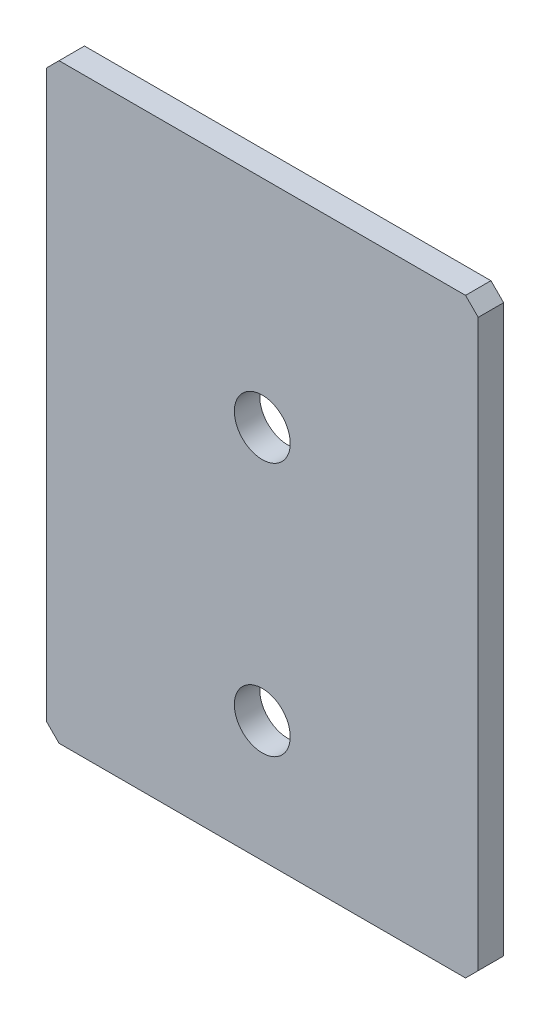
ISO-10303-21;
HEADER;
FILE_DESCRIPTION(('STEP AP214'),'2;1');
FILE_NAME('part.step','',(''),(''),'','','');
FILE_SCHEMA(('AUTOMOTIVE_DESIGN { 1 0 10303 214 1 1 1 1 }'));
ENDSEC;
DATA;
#1=APPLICATION_CONTEXT('core data for automotive mechanical design processes');
#2=APPLICATION_PROTOCOL_DEFINITION('international standard','automotive_design',2000,#1);
#3=PRODUCT_CONTEXT('',#1,'mechanical');
#4=PRODUCT('Part','Part','',(#3));
#5=PRODUCT_RELATED_PRODUCT_CATEGORY('part','',(#4));
#6=PRODUCT_DEFINITION_FORMATION('','',#4);
#7=PRODUCT_DEFINITION_CONTEXT('part definition',#1,'design');
#8=PRODUCT_DEFINITION('design','',#6,#7);
#9=PRODUCT_DEFINITION_SHAPE('','',#8);
#10=(LENGTH_UNIT() NAMED_UNIT(*) SI_UNIT(.MILLI.,.METRE.));
#11=(NAMED_UNIT(*) PLANE_ANGLE_UNIT() SI_UNIT($,.RADIAN.));
#12=(NAMED_UNIT(*) SI_UNIT($,.STERADIAN.) SOLID_ANGLE_UNIT());
#13=UNCERTAINTY_MEASURE_WITH_UNIT(LENGTH_MEASURE(1.E-05),#10,'distance_accuracy_value','');
#14=(GEOMETRIC_REPRESENTATION_CONTEXT(3) GLOBAL_UNCERTAINTY_ASSIGNED_CONTEXT((#13)) GLOBAL_UNIT_ASSIGNED_CONTEXT((#10,
#11,#12)) REPRESENTATION_CONTEXT('',''));
#15=CARTESIAN_POINT('',(0.,0.,0.));
#16=DIRECTION('',(0.,0.,1.));
#17=DIRECTION('',(1.,0.,0.));
#18=AXIS2_PLACEMENT_3D('',#15,#16,#17);
#19=CARTESIAN_POINT('',(0.,0.,10.));
#20=DIRECTION('',(0.,0.,1.));
#21=DIRECTION('',(1.,0.,0.));
#22=AXIS2_PLACEMENT_3D('',#19,#20,#21);
#23=PLANE('',#22);
#24=CARTESIAN_POINT('',(0.,0.,10.));
#25=DIRECTION('',(0.,0.,1.));
#26=DIRECTION('',(1.,0.,0.));
#27=AXIS2_PLACEMENT_3D('',#24,#25,#26);
#28=CIRCLE('',#27,11.);
#29=CARTESIAN_POINT('',(11.,0.,10.));
#30=VERTEX_POINT('',#29);
#31=EDGE_CURVE('E187',#30,#30,#28,.T.);
#32=ORIENTED_EDGE('',*,*,#31,.F.);
#33=EDGE_LOOP('',(#32));
#34=FACE_BOUND('',#33,.T.);
#35=DIRECTION('',(1.,0.,0.));
#36=VECTOR('',#35,1.);
#37=CARTESIAN_POINT('',(-85.,-147.717889212796,10.));
#38=LINE('',#37,#36);
#39=CARTESIAN_POINT('',(-80.,-147.717889212796,10.));
#40=VERTEX_POINT('',#39);
#41=CARTESIAN_POINT('',(80.,-147.717889212796,10.));
#42=VERTEX_POINT('',#41);
#43=EDGE_CURVE('E178',#40,#42,#38,.T.);
#44=ORIENTED_EDGE('',*,*,#43,.T.);
#45=DIRECTION('',(-0.707106781186551,-0.707106781186544,0.));
#46=VECTOR('',#45,1.);
#47=CARTESIAN_POINT('',(113.858944606398,-113.858944606399,10.));
#48=LINE('',#47,#46);
#49=CARTESIAN_POINT('',(85.,-142.717889212796,10.));
#50=VERTEX_POINT('',#49);
#51=EDGE_CURVE('E156',#42,#50,#48,.F.);
#52=ORIENTED_EDGE('',*,*,#51,.T.);
#53=DIRECTION('',(0.,1.,0.));
#54=VECTOR('',#53,1.);
#55=CARTESIAN_POINT('',(85.,85.,10.));
#56=LINE('',#55,#54);
#57=CARTESIAN_POINT('',(85.,80.,10.));
#58=VERTEX_POINT('',#57);
#59=EDGE_CURVE('E126',#50,#58,#56,.T.);
#60=ORIENTED_EDGE('',*,*,#59,.T.);
#61=DIRECTION('',(0.707106781186546,-0.707106781186549,0.));
#62=VECTOR('',#61,1.);
#63=CARTESIAN_POINT('',(82.5000000000003,82.4999999999998,10.));
#64=LINE('',#63,#62);
#65=CARTESIAN_POINT('',(80.,85.,10.));
#66=VERTEX_POINT('',#65);
#67=EDGE_CURVE('E62',#58,#66,#64,.F.);
#68=ORIENTED_EDGE('',*,*,#67,.T.);
#69=DIRECTION('',(-1.,0.,0.));
#70=VECTOR('',#69,1.);
#71=CARTESIAN_POINT('',(-85.,85.,10.));
#72=LINE('',#71,#70);
#73=CARTESIAN_POINT('',(-80.,85.,10.));
#74=VERTEX_POINT('',#73);
#75=EDGE_CURVE('E142',#66,#74,#72,.T.);
#76=ORIENTED_EDGE('',*,*,#75,.T.);
#77=DIRECTION('',(0.707106781186548,0.707106781186548,0.));
#78=VECTOR('',#77,1.);
#79=CARTESIAN_POINT('',(-82.5,82.5,10.));
#80=LINE('',#79,#78);
#81=CARTESIAN_POINT('',(-85.,79.9999999999999,10.));
#82=VERTEX_POINT('',#81);
#83=EDGE_CURVE('E152',#74,#82,#80,.F.);
#84=ORIENTED_EDGE('',*,*,#83,.T.);
#85=DIRECTION('',(0.,-1.,0.));
#86=VECTOR('',#85,1.);
#87=CARTESIAN_POINT('',(-85.,85.,10.));
#88=LINE('',#87,#86);
#89=CARTESIAN_POINT('',(-85.,-142.717889212796,10.));
#90=VERTEX_POINT('',#89);
#91=EDGE_CURVE('E136',#82,#90,#88,.T.);
#92=ORIENTED_EDGE('',*,*,#91,.T.);
#93=DIRECTION('',(-0.707106781186546,0.707106781186549,0.));
#94=VECTOR('',#93,1.);
#95=CARTESIAN_POINT('',(-113.858944606398,-113.858944606398,10.));
#96=LINE('',#95,#94);
#97=EDGE_CURVE('E154',#90,#40,#96,.F.);
#98=ORIENTED_EDGE('',*,*,#97,.T.);
#99=EDGE_LOOP('',(#44,#52,#60,#68,#76,#84,#92,#98));
#100=FACE_BOUND('',#99,.T.);
#101=CARTESIAN_POINT('',(0.,-100.,10.));
#102=DIRECTION('',(0.,0.,1.));
#103=DIRECTION('',(1.,0.,0.));
#104=AXIS2_PLACEMENT_3D('',#101,#102,#103);
#105=CIRCLE('',#104,11.);
#106=CARTESIAN_POINT('',(11.,-100.,10.));
#107=VERTEX_POINT('',#106);
#108=EDGE_CURVE('E192',#107,#107,#105,.T.);
#109=ORIENTED_EDGE('',*,*,#108,.F.);
#110=EDGE_LOOP('',(#109));
#111=FACE_BOUND('',#110,.T.);
#112=ADVANCED_FACE('F41',(#34,#100,#111),#23,.T.);
#113=CARTESIAN_POINT('',(0.,0.,0.));
#114=DIRECTION('',(0.,0.,1.));
#115=DIRECTION('',(1.,0.,0.));
#116=AXIS2_PLACEMENT_3D('',#113,#114,#115);
#117=PLANE('',#116);
#118=DIRECTION('',(0.,1.,0.));
#119=VECTOR('',#118,1.);
#120=CARTESIAN_POINT('',(85.,85.,0.));
#121=LINE('',#120,#119);
#122=CARTESIAN_POINT('',(85.,-142.717889212796,0.));
#123=VERTEX_POINT('',#122);
#124=CARTESIAN_POINT('',(85.,80.,0.));
#125=VERTEX_POINT('',#124);
#126=EDGE_CURVE('E124',#123,#125,#121,.T.);
#127=ORIENTED_EDGE('',*,*,#126,.F.);
#128=DIRECTION('',(0.707106781186551,0.707106781186544,0.));
#129=VECTOR('',#128,1.);
#130=CARTESIAN_POINT('',(85.,-142.717889212796,0.));
#131=LINE('',#130,#129);
#132=CARTESIAN_POINT('',(80.,-147.717889212796,0.));
#133=VERTEX_POINT('',#132);
#134=EDGE_CURVE('E107',#123,#133,#131,.F.);
#135=ORIENTED_EDGE('',*,*,#134,.T.);
#136=DIRECTION('',(1.,0.,0.));
#137=VECTOR('',#136,1.);
#138=CARTESIAN_POINT('',(-85.,-147.717889212796,0.));
#139=LINE('',#138,#137);
#140=CARTESIAN_POINT('',(-80.,-147.717889212796,0.));
#141=VERTEX_POINT('',#140);
#142=EDGE_CURVE('E134',#141,#133,#139,.T.);
#143=ORIENTED_EDGE('',*,*,#142,.F.);
#144=DIRECTION('',(0.707106781186546,-0.707106781186549,0.));
#145=VECTOR('',#144,1.);
#146=CARTESIAN_POINT('',(-80.,-147.717889212796,0.));
#147=LINE('',#146,#145);
#148=CARTESIAN_POINT('',(-85.,-142.717889212796,0.));
#149=VERTEX_POINT('',#148);
#150=EDGE_CURVE('E118',#141,#149,#147,.F.);
#151=ORIENTED_EDGE('',*,*,#150,.T.);
#152=DIRECTION('',(0.,-1.,0.));
#153=VECTOR('',#152,1.);
#154=CARTESIAN_POINT('',(-85.,85.,0.));
#155=LINE('',#154,#153);
#156=CARTESIAN_POINT('',(-85.,79.9999999999999,0.));
#157=VERTEX_POINT('',#156);
#158=EDGE_CURVE('E138',#157,#149,#155,.T.);
#159=ORIENTED_EDGE('',*,*,#158,.F.);
#160=DIRECTION('',(-0.707106781186548,-0.707106781186548,0.));
#161=VECTOR('',#160,1.);
#162=CARTESIAN_POINT('',(-85.,79.9999999999999,0.));
#163=LINE('',#162,#161);
#164=CARTESIAN_POINT('',(-80.,85.,0.));
#165=VERTEX_POINT('',#164);
#166=EDGE_CURVE('E145',#157,#165,#163,.F.);
#167=ORIENTED_EDGE('',*,*,#166,.T.);
#168=DIRECTION('',(-1.,0.,0.));
#169=VECTOR('',#168,1.);
#170=CARTESIAN_POINT('',(-85.,85.,0.));
#171=LINE('',#170,#169);
#172=CARTESIAN_POINT('',(80.,85.,0.));
#173=VERTEX_POINT('',#172);
#174=EDGE_CURVE('E133',#173,#165,#171,.T.);
#175=ORIENTED_EDGE('',*,*,#174,.F.);
#176=DIRECTION('',(-0.707106781186546,0.707106781186549,0.));
#177=VECTOR('',#176,1.);
#178=CARTESIAN_POINT('',(80.,85.,0.));
#179=LINE('',#178,#177);
#180=EDGE_CURVE('E127',#173,#125,#179,.F.);
#181=ORIENTED_EDGE('',*,*,#180,.T.);
#182=EDGE_LOOP('',(#127,#135,#143,#151,#159,#167,#175,#181));
#183=FACE_BOUND('',#182,.T.);
#184=CARTESIAN_POINT('',(0.,0.,0.));
#185=DIRECTION('',(0.,0.,1.));
#186=DIRECTION('',(1.,0.,0.));
#187=AXIS2_PLACEMENT_3D('',#184,#185,#186);
#188=CIRCLE('',#187,11.);
#189=CARTESIAN_POINT('',(11.,0.,0.));
#190=VERTEX_POINT('',#189);
#191=EDGE_CURVE('E183',#190,#190,#188,.T.);
#192=ORIENTED_EDGE('',*,*,#191,.T.);
#193=EDGE_LOOP('',(#192));
#194=FACE_BOUND('',#193,.T.);
#195=CARTESIAN_POINT('',(0.,-100.,0.));
#196=DIRECTION('',(0.,0.,1.));
#197=DIRECTION('',(1.,0.,0.));
#198=AXIS2_PLACEMENT_3D('',#195,#196,#197);
#199=CIRCLE('',#198,11.);
#200=CARTESIAN_POINT('',(11.,-100.,0.));
#201=VERTEX_POINT('',#200);
#202=EDGE_CURVE('E194',#201,#201,#199,.T.);
#203=ORIENTED_EDGE('',*,*,#202,.T.);
#204=EDGE_LOOP('',(#203));
#205=FACE_BOUND('',#204,.T.);
#206=ADVANCED_FACE('F130',(#183,#194,#205),#117,.F.);
#207=CARTESIAN_POINT('',(-85.,85.,10.));
#208=DIRECTION('',(1.,0.,0.));
#209=DIRECTION('',(0.,0.,-1.));
#210=AXIS2_PLACEMENT_3D('',#207,#208,#209);
#211=PLANE('',#210);
#212=ORIENTED_EDGE('',*,*,#158,.T.);
#213=DIRECTION('',(0.,0.,1.));
#214=VECTOR('',#213,1.);
#215=CARTESIAN_POINT('',(-85.,-142.717889212796,10.));
#216=LINE('',#215,#214);
#217=EDGE_CURVE('E161',#149,#90,#216,.T.);
#218=ORIENTED_EDGE('',*,*,#217,.T.);
#219=ORIENTED_EDGE('',*,*,#91,.F.);
#220=DIRECTION('',(0.,0.,-1.));
#221=VECTOR('',#220,1.);
#222=CARTESIAN_POINT('',(-85.,79.9999999999999,10.));
#223=LINE('',#222,#221);
#224=EDGE_CURVE('E158',#82,#157,#223,.T.);
#225=ORIENTED_EDGE('',*,*,#224,.T.);
#226=EDGE_LOOP('',(#212,#218,#219,#225));
#227=FACE_BOUND('',#226,.T.);
#228=ADVANCED_FACE('F174',(#227),#211,.F.);
#229=CARTESIAN_POINT('',(-85.,-147.717889212796,10.));
#230=DIRECTION('',(0.,1.,0.));
#231=DIRECTION('',(0.,0.,1.));
#232=AXIS2_PLACEMENT_3D('',#229,#230,#231);
#233=PLANE('',#232);
#234=ORIENTED_EDGE('',*,*,#142,.T.);
#235=DIRECTION('',(0.,0.,1.));
#236=VECTOR('',#235,1.);
#237=CARTESIAN_POINT('',(80.,-147.717889212796,10.));
#238=LINE('',#237,#236);
#239=EDGE_CURVE('E112',#133,#42,#238,.T.);
#240=ORIENTED_EDGE('',*,*,#239,.T.);
#241=ORIENTED_EDGE('',*,*,#43,.F.);
#242=DIRECTION('',(0.,0.,-1.));
#243=VECTOR('',#242,1.);
#244=CARTESIAN_POINT('',(-80.,-147.717889212796,10.));
#245=LINE('',#244,#243);
#246=EDGE_CURVE('E117',#40,#141,#245,.T.);
#247=ORIENTED_EDGE('',*,*,#246,.T.);
#248=EDGE_LOOP('',(#234,#240,#241,#247));
#249=FACE_BOUND('',#248,.T.);
#250=ADVANCED_FACE('F218',(#249),#233,.F.);
#251=CARTESIAN_POINT('',(85.,85.,10.));
#252=DIRECTION('',(-1.,0.,0.));
#253=DIRECTION('',(0.,0.,1.));
#254=AXIS2_PLACEMENT_3D('',#251,#252,#253);
#255=PLANE('',#254);
#256=ORIENTED_EDGE('',*,*,#59,.F.);
#257=DIRECTION('',(0.,0.,-1.));
#258=VECTOR('',#257,1.);
#259=CARTESIAN_POINT('',(85.,-142.717889212796,10.));
#260=LINE('',#259,#258);
#261=EDGE_CURVE('E111',#50,#123,#260,.T.);
#262=ORIENTED_EDGE('',*,*,#261,.T.);
#263=ORIENTED_EDGE('',*,*,#126,.T.);
#264=DIRECTION('',(0.,0.,1.));
#265=VECTOR('',#264,1.);
#266=CARTESIAN_POINT('',(85.,80.,10.));
#267=LINE('',#266,#265);
#268=EDGE_CURVE('E128',#125,#58,#267,.T.);
#269=ORIENTED_EDGE('',*,*,#268,.T.);
#270=EDGE_LOOP('',(#256,#262,#263,#269));
#271=FACE_BOUND('',#270,.T.);
#272=ADVANCED_FACE('F123',(#271),#255,.F.);
#273=CARTESIAN_POINT('',(-85.,85.,10.));
#274=DIRECTION('',(0.,-1.,0.));
#275=DIRECTION('',(0.,0.,-1.));
#276=AXIS2_PLACEMENT_3D('',#273,#274,#275);
#277=PLANE('',#276);
#278=ORIENTED_EDGE('',*,*,#174,.T.);
#279=DIRECTION('',(0.,0.,1.));
#280=VECTOR('',#279,1.);
#281=CARTESIAN_POINT('',(-80.,85.,10.));
#282=LINE('',#281,#280);
#283=EDGE_CURVE('E11',#165,#74,#282,.T.);
#284=ORIENTED_EDGE('',*,*,#283,.T.);
#285=ORIENTED_EDGE('',*,*,#75,.F.);
#286=DIRECTION('',(0.,0.,-1.));
#287=VECTOR('',#286,1.);
#288=CARTESIAN_POINT('',(80.,85.,10.));
#289=LINE('',#288,#287);
#290=EDGE_CURVE('E50',#66,#173,#289,.T.);
#291=ORIENTED_EDGE('',*,*,#290,.T.);
#292=EDGE_LOOP('',(#278,#284,#285,#291));
#293=FACE_BOUND('',#292,.T.);
#294=ADVANCED_FACE('F164',(#293),#277,.F.);
#295=CARTESIAN_POINT('',(0.,0.,10.));
#296=DIRECTION('',(0.,0.,-1.));
#297=DIRECTION('',(-1.,0.,0.));
#298=AXIS2_PLACEMENT_3D('',#295,#296,#297);
#299=CYLINDRICAL_SURFACE('',#298,11.);
#300=ORIENTED_EDGE('',*,*,#31,.T.);
#301=EDGE_LOOP('',(#300));
#302=FACE_BOUND('',#301,.T.);
#303=ORIENTED_EDGE('',*,*,#191,.F.);
#304=EDGE_LOOP('',(#303));
#305=FACE_BOUND('',#304,.T.);
#306=ADVANCED_FACE('F211',(#302,#305),#299,.F.);
#307=CARTESIAN_POINT('',(0.,-100.,10.));
#308=DIRECTION('',(0.,0.,-1.));
#309=DIRECTION('',(-1.,0.,0.));
#310=AXIS2_PLACEMENT_3D('',#307,#308,#309);
#311=CYLINDRICAL_SURFACE('',#310,11.);
#312=ORIENTED_EDGE('',*,*,#108,.T.);
#313=EDGE_LOOP('',(#312));
#314=FACE_BOUND('',#313,.T.);
#315=ORIENTED_EDGE('',*,*,#202,.F.);
#316=EDGE_LOOP('',(#315));
#317=FACE_BOUND('',#316,.T.);
#318=ADVANCED_FACE('F200',(#314,#317),#311,.F.);
#319=CARTESIAN_POINT('',(85.,-142.717889212796,10.));
#320=DIRECTION('',(-0.707106781186544,0.707106781186551,0.));
#321=DIRECTION('',(0.,0.,-1.));
#322=AXIS2_PLACEMENT_3D('',#319,#320,#321);
#323=PLANE('',#322);
#324=ORIENTED_EDGE('',*,*,#51,.F.);
#325=ORIENTED_EDGE('',*,*,#239,.F.);
#326=ORIENTED_EDGE('',*,*,#134,.F.);
#327=ORIENTED_EDGE('',*,*,#261,.F.);
#328=EDGE_LOOP('',(#324,#325,#326,#327));
#329=FACE_BOUND('',#328,.T.);
#330=ADVANCED_FACE('F110',(#329),#323,.F.);
#331=CARTESIAN_POINT('',(-80.,-147.717889212796,10.));
#332=DIRECTION('',(0.707106781186549,0.707106781186546,0.));
#333=DIRECTION('',(0.,0.,-1.));
#334=AXIS2_PLACEMENT_3D('',#331,#332,#333);
#335=PLANE('',#334);
#336=ORIENTED_EDGE('',*,*,#97,.F.);
#337=ORIENTED_EDGE('',*,*,#217,.F.);
#338=ORIENTED_EDGE('',*,*,#150,.F.);
#339=ORIENTED_EDGE('',*,*,#246,.F.);
#340=EDGE_LOOP('',(#336,#337,#338,#339));
#341=FACE_BOUND('',#340,.T.);
#342=ADVANCED_FACE('F230',(#341),#335,.F.);
#343=CARTESIAN_POINT('',(-85.,79.9999999999999,10.));
#344=DIRECTION('',(0.707106781186547,-0.707106781186547,0.));
#345=DIRECTION('',(0.,0.,-1.));
#346=AXIS2_PLACEMENT_3D('',#343,#344,#345);
#347=PLANE('',#346);
#348=ORIENTED_EDGE('',*,*,#83,.F.);
#349=ORIENTED_EDGE('',*,*,#283,.F.);
#350=ORIENTED_EDGE('',*,*,#166,.F.);
#351=ORIENTED_EDGE('',*,*,#224,.F.);
#352=EDGE_LOOP('',(#348,#349,#350,#351));
#353=FACE_BOUND('',#352,.T.);
#354=ADVANCED_FACE('F171',(#353),#347,.F.);
#355=CARTESIAN_POINT('',(80.,85.,10.));
#356=DIRECTION('',(-0.707106781186549,-0.707106781186546,0.));
#357=DIRECTION('',(0.,0.,-1.));
#358=AXIS2_PLACEMENT_3D('',#355,#356,#357);
#359=PLANE('',#358);
#360=ORIENTED_EDGE('',*,*,#67,.F.);
#361=ORIENTED_EDGE('',*,*,#268,.F.);
#362=ORIENTED_EDGE('',*,*,#180,.F.);
#363=ORIENTED_EDGE('',*,*,#290,.F.);
#364=EDGE_LOOP('',(#360,#361,#362,#363));
#365=FACE_BOUND('',#364,.T.);
#366=ADVANCED_FACE('F44',(#365),#359,.F.);
#367=CLOSED_SHELL('',(#112,#206,#228,#250,#272,#294,#306,#318,#330,#342,#354,#366));
#368=MANIFOLD_SOLID_BREP('B2',#367);
#369=ADVANCED_BREP_SHAPE_REPRESENTATION('',(#18,#368),#14);
#370=SHAPE_DEFINITION_REPRESENTATION(#9,#369);
ENDSEC;
END-ISO-10303-21;
